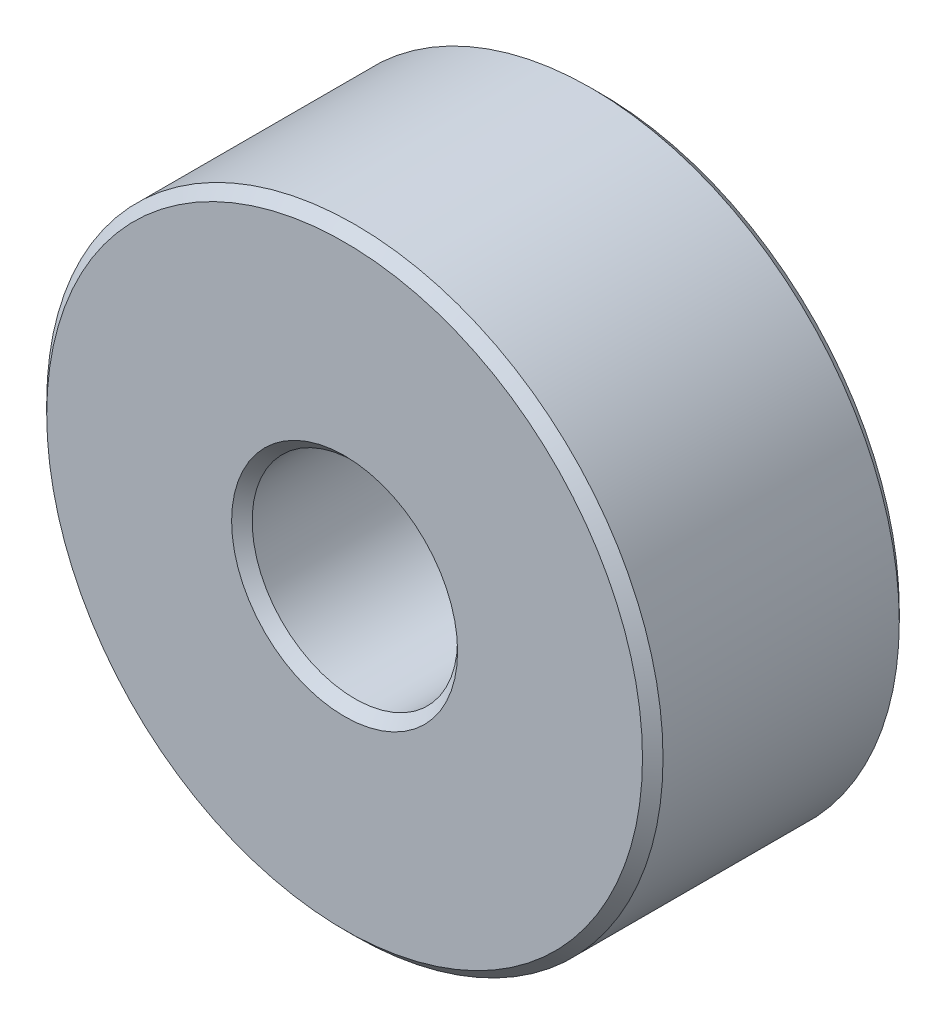
ISO-10303-21;
HEADER;
FILE_DESCRIPTION(('STEP AP214'),'2;1');
FILE_NAME('part.step','',(''),(''),'','','');
FILE_SCHEMA(('AUTOMOTIVE_DESIGN { 1 0 10303 214 1 1 1 1 }'));
ENDSEC;
DATA;
#1=APPLICATION_CONTEXT('core data for automotive mechanical design processes');
#2=APPLICATION_PROTOCOL_DEFINITION('international standard','automotive_design',2000,#1);
#3=PRODUCT_CONTEXT('',#1,'mechanical');
#4=PRODUCT('Part','Part','',(#3));
#5=PRODUCT_RELATED_PRODUCT_CATEGORY('part','',(#4));
#6=PRODUCT_DEFINITION_FORMATION('','',#4);
#7=PRODUCT_DEFINITION_CONTEXT('part definition',#1,'design');
#8=PRODUCT_DEFINITION('design','',#6,#7);
#9=PRODUCT_DEFINITION_SHAPE('','',#8);
#10=(LENGTH_UNIT() NAMED_UNIT(*) SI_UNIT(.MILLI.,.METRE.));
#11=(NAMED_UNIT(*) PLANE_ANGLE_UNIT() SI_UNIT($,.RADIAN.));
#12=(NAMED_UNIT(*) SI_UNIT($,.STERADIAN.) SOLID_ANGLE_UNIT());
#13=UNCERTAINTY_MEASURE_WITH_UNIT(LENGTH_MEASURE(1.E-05),#10,'distance_accuracy_value','');
#14=(GEOMETRIC_REPRESENTATION_CONTEXT(3) GLOBAL_UNCERTAINTY_ASSIGNED_CONTEXT((#13)) GLOBAL_UNIT_ASSIGNED_CONTEXT((#10,
#11,#12)) REPRESENTATION_CONTEXT('',''));
#15=CARTESIAN_POINT('',(0.,0.,0.));
#16=DIRECTION('',(0.,0.,1.));
#17=DIRECTION('',(1.,0.,0.));
#18=AXIS2_PLACEMENT_3D('',#15,#16,#17);
#19=CARTESIAN_POINT('',(0.,0.,2.5));
#20=DIRECTION('',(0.,0.,1.));
#21=DIRECTION('',(1.,0.,0.));
#22=AXIS2_PLACEMENT_3D('',#19,#20,#21);
#23=PLANE('',#22);
#24=CARTESIAN_POINT('',(0.,0.,2.5));
#25=DIRECTION('',(0.,0.,1.));
#26=DIRECTION('',(1.,0.,0.));
#27=AXIS2_PLACEMENT_3D('',#24,#25,#26);
#28=CIRCLE('',#27,1.1);
#29=CARTESIAN_POINT('',(1.1,0.,2.5));
#30=VERTEX_POINT('',#29);
#31=EDGE_CURVE('E10',#30,#30,#28,.F.);
#32=ORIENTED_EDGE('',*,*,#31,.T.);
#33=EDGE_LOOP('',(#32));
#34=FACE_BOUND('',#33,.T.);
#35=CARTESIAN_POINT('',(0.,0.,2.5));
#36=DIRECTION('',(0.,0.,1.));
#37=DIRECTION('',(1.,0.,0.));
#38=AXIS2_PLACEMENT_3D('',#35,#36,#37);
#39=CIRCLE('',#38,2.9);
#40=CARTESIAN_POINT('',(2.9,0.,2.5));
#41=VERTEX_POINT('',#40);
#42=EDGE_CURVE('E41',#41,#41,#39,.T.);
#43=ORIENTED_EDGE('',*,*,#42,.T.);
#44=EDGE_LOOP('',(#43));
#45=FACE_BOUND('',#44,.T.);
#46=ADVANCED_FACE('F33',(#34,#45),#23,.T.);
#47=CARTESIAN_POINT('',(0.,0.,0.));
#48=DIRECTION('',(0.,0.,1.));
#49=DIRECTION('',(1.,0.,0.));
#50=AXIS2_PLACEMENT_3D('',#47,#48,#49);
#51=PLANE('',#50);
#52=CARTESIAN_POINT('',(0.,0.,0.));
#53=DIRECTION('',(0.,0.,1.));
#54=DIRECTION('',(1.,0.,0.));
#55=AXIS2_PLACEMENT_3D('',#52,#53,#54);
#56=CIRCLE('',#55,1.1);
#57=CARTESIAN_POINT('',(1.1,0.,0.));
#58=VERTEX_POINT('',#57);
#59=EDGE_CURVE('E60',#58,#58,#56,.T.);
#60=ORIENTED_EDGE('',*,*,#59,.T.);
#61=EDGE_LOOP('',(#60));
#62=FACE_BOUND('',#61,.T.);
#63=CARTESIAN_POINT('',(0.,0.,0.));
#64=DIRECTION('',(0.,0.,1.));
#65=DIRECTION('',(1.,0.,0.));
#66=AXIS2_PLACEMENT_3D('',#63,#64,#65);
#67=CIRCLE('',#66,2.9);
#68=CARTESIAN_POINT('',(2.9,0.,0.));
#69=VERTEX_POINT('',#68);
#70=EDGE_CURVE('E63',#69,#69,#67,.F.);
#71=ORIENTED_EDGE('',*,*,#70,.T.);
#72=EDGE_LOOP('',(#71));
#73=FACE_BOUND('',#72,.T.);
#74=ADVANCED_FACE('F67',(#62,#73),#51,.F.);
#75=CARTESIAN_POINT('',(0.,0.,2.5));
#76=DIRECTION('',(0.,0.,-1.));
#77=DIRECTION('',(-1.,0.,0.));
#78=AXIS2_PLACEMENT_3D('',#75,#76,#77);
#79=CYLINDRICAL_SURFACE('',#78,3.);
#80=CARTESIAN_POINT('',(0.,0.,0.100000000000001));
#81=DIRECTION('',(0.,0.,1.));
#82=DIRECTION('',(1.,0.,0.));
#83=AXIS2_PLACEMENT_3D('',#80,#81,#82);
#84=CIRCLE('',#83,3.);
#85=CARTESIAN_POINT('',(3.,0.,0.100000000000001));
#86=VERTEX_POINT('',#85);
#87=EDGE_CURVE('E45',#86,#86,#84,.T.);
#88=ORIENTED_EDGE('',*,*,#87,.T.);
#89=EDGE_LOOP('',(#88));
#90=FACE_BOUND('',#89,.T.);
#91=CARTESIAN_POINT('',(0.,0.,2.4));
#92=DIRECTION('',(0.,0.,1.));
#93=DIRECTION('',(1.,0.,0.));
#94=AXIS2_PLACEMENT_3D('',#91,#92,#93);
#95=CIRCLE('',#94,3.);
#96=CARTESIAN_POINT('',(3.,0.,2.4));
#97=VERTEX_POINT('',#96);
#98=EDGE_CURVE('E49',#97,#97,#95,.F.);
#99=ORIENTED_EDGE('',*,*,#98,.T.);
#100=EDGE_LOOP('',(#99));
#101=FACE_BOUND('',#100,.T.);
#102=ADVANCED_FACE('F77',(#90,#101),#79,.T.);
#103=CARTESIAN_POINT('',(0.,0.,2.5));
#104=DIRECTION('',(0.,0.,-1.));
#105=DIRECTION('',(-1.,0.,0.));
#106=AXIS2_PLACEMENT_3D('',#103,#104,#105);
#107=CYLINDRICAL_SURFACE('',#106,1.);
#108=CARTESIAN_POINT('',(0.,0.,0.0999999999999994));
#109=DIRECTION('',(0.,0.,1.));
#110=DIRECTION('',(1.,0.,0.));
#111=AXIS2_PLACEMENT_3D('',#108,#109,#110);
#112=CIRCLE('',#111,1.);
#113=CARTESIAN_POINT('',(1.,0.,0.0999999999999994));
#114=VERTEX_POINT('',#113);
#115=EDGE_CURVE('E54',#114,#114,#112,.F.);
#116=ORIENTED_EDGE('',*,*,#115,.T.);
#117=EDGE_LOOP('',(#116));
#118=FACE_BOUND('',#117,.T.);
#119=CARTESIAN_POINT('',(0.,0.,2.4));
#120=DIRECTION('',(0.,0.,1.));
#121=DIRECTION('',(1.,0.,0.));
#122=AXIS2_PLACEMENT_3D('',#119,#120,#121);
#123=CIRCLE('',#122,1.);
#124=CARTESIAN_POINT('',(1.,0.,2.4));
#125=VERTEX_POINT('',#124);
#126=EDGE_CURVE('E57',#125,#125,#123,.T.);
#127=ORIENTED_EDGE('',*,*,#126,.T.);
#128=EDGE_LOOP('',(#127));
#129=FACE_BOUND('',#128,.T.);
#130=ADVANCED_FACE('F80',(#118,#129),#107,.F.);
#131=CARTESIAN_POINT('',(0.,0.,0.));
#132=DIRECTION('',(0.,0.,-1.));
#133=DIRECTION('',(-1.,0.,0.));
#134=AXIS2_PLACEMENT_3D('',#131,#132,#133);
#135=CONICAL_SURFACE('',#134,1.1,0.785398163397448);
#136=ORIENTED_EDGE('',*,*,#115,.F.);
#137=EDGE_LOOP('',(#136));
#138=FACE_BOUND('',#137,.T.);
#139=ORIENTED_EDGE('',*,*,#59,.F.);
#140=EDGE_LOOP('',(#139));
#141=FACE_BOUND('',#140,.T.);
#142=ADVANCED_FACE('F73',(#138,#141),#135,.F.);
#143=CARTESIAN_POINT('',(0.,0.,0.100000000000001));
#144=DIRECTION('',(0.,0.,1.));
#145=DIRECTION('',(1.,0.,0.));
#146=AXIS2_PLACEMENT_3D('',#143,#144,#145);
#147=CONICAL_SURFACE('',#146,3.,0.785398163397448);
#148=ORIENTED_EDGE('',*,*,#70,.F.);
#149=EDGE_LOOP('',(#148));
#150=FACE_BOUND('',#149,.T.);
#151=ORIENTED_EDGE('',*,*,#87,.F.);
#152=EDGE_LOOP('',(#151));
#153=FACE_BOUND('',#152,.T.);
#154=ADVANCED_FACE('F69',(#150,#153),#147,.T.);
#155=CARTESIAN_POINT('',(0.,0.,2.4));
#156=DIRECTION('',(0.,0.,1.));
#157=DIRECTION('',(1.,0.,0.));
#158=AXIS2_PLACEMENT_3D('',#155,#156,#157);
#159=CONICAL_SURFACE('',#158,1.,0.785398163397448);
#160=ORIENTED_EDGE('',*,*,#31,.F.);
#161=EDGE_LOOP('',(#160));
#162=FACE_BOUND('',#161,.T.);
#163=ORIENTED_EDGE('',*,*,#126,.F.);
#164=EDGE_LOOP('',(#163));
#165=FACE_BOUND('',#164,.T.);
#166=ADVANCED_FACE('F72',(#162,#165),#159,.F.);
#167=CARTESIAN_POINT('',(0.,0.,2.5));
#168=DIRECTION('',(0.,0.,-1.));
#169=DIRECTION('',(-1.,0.,0.));
#170=AXIS2_PLACEMENT_3D('',#167,#168,#169);
#171=CONICAL_SURFACE('',#170,2.9,0.785398163397444);
#172=ORIENTED_EDGE('',*,*,#98,.F.);
#173=EDGE_LOOP('',(#172));
#174=FACE_BOUND('',#173,.T.);
#175=ORIENTED_EDGE('',*,*,#42,.F.);
#176=EDGE_LOOP('',(#175));
#177=FACE_BOUND('',#176,.T.);
#178=ADVANCED_FACE('F36',(#174,#177),#171,.T.);
#179=CLOSED_SHELL('',(#46,#74,#102,#130,#142,#154,#166,#178));
#180=MANIFOLD_SOLID_BREP('B2',#179);
#181=ADVANCED_BREP_SHAPE_REPRESENTATION('',(#18,#180),#14);
#182=SHAPE_DEFINITION_REPRESENTATION(#9,#181);
ENDSEC;
END-ISO-10303-21;
